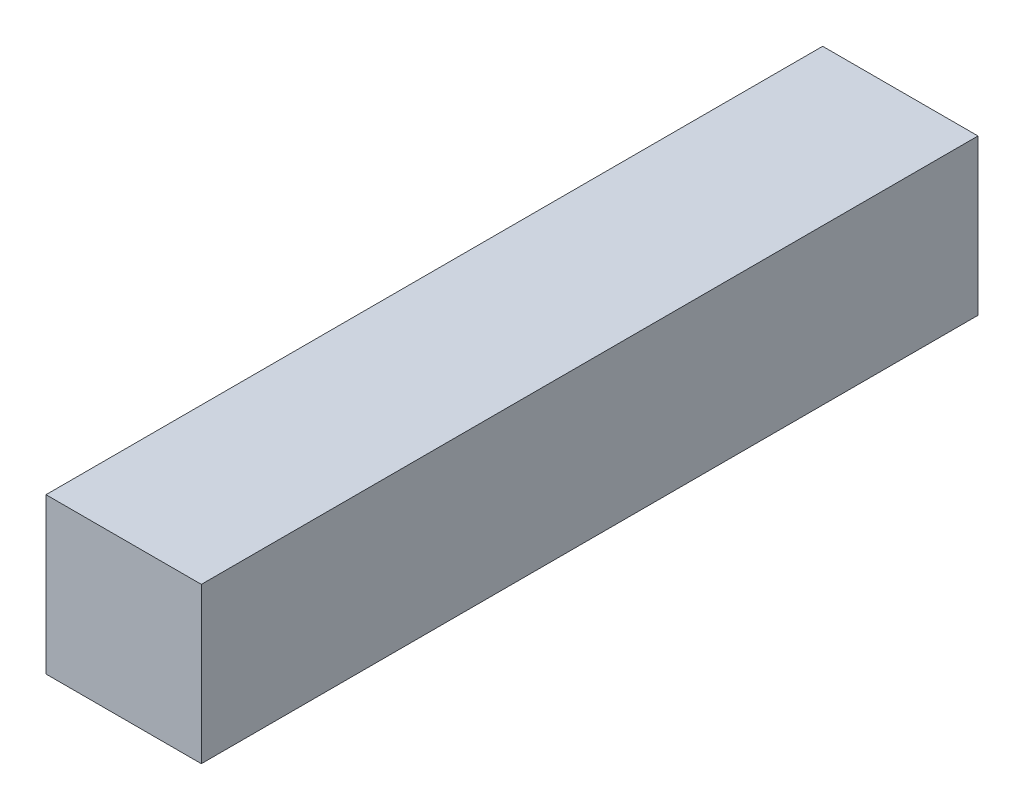
ISO-10303-21;
HEADER;
FILE_DESCRIPTION(('STEP AP214'),'2;1');
FILE_NAME('part.step','',(''),(''),'','','');
FILE_SCHEMA(('AUTOMOTIVE_DESIGN { 1 0 10303 214 1 1 1 1 }'));
ENDSEC;
DATA;
#1=APPLICATION_CONTEXT('core data for automotive mechanical design processes');
#2=APPLICATION_PROTOCOL_DEFINITION('international standard','automotive_design',2000,#1);
#3=PRODUCT_CONTEXT('',#1,'mechanical');
#4=PRODUCT('Part','Part','',(#3));
#5=PRODUCT_RELATED_PRODUCT_CATEGORY('part','',(#4));
#6=PRODUCT_DEFINITION_FORMATION('','',#4);
#7=PRODUCT_DEFINITION_CONTEXT('part definition',#1,'design');
#8=PRODUCT_DEFINITION('design','',#6,#7);
#9=PRODUCT_DEFINITION_SHAPE('','',#8);
#10=(LENGTH_UNIT() NAMED_UNIT(*) SI_UNIT(.MILLI.,.METRE.));
#11=(NAMED_UNIT(*) PLANE_ANGLE_UNIT() SI_UNIT($,.RADIAN.));
#12=(NAMED_UNIT(*) SI_UNIT($,.STERADIAN.) SOLID_ANGLE_UNIT());
#13=UNCERTAINTY_MEASURE_WITH_UNIT(LENGTH_MEASURE(1.E-05),#10,'distance_accuracy_value','');
#14=(GEOMETRIC_REPRESENTATION_CONTEXT(3) GLOBAL_UNCERTAINTY_ASSIGNED_CONTEXT((#13)) GLOBAL_UNIT_ASSIGNED_CONTEXT((#10,
#11,#12)) REPRESENTATION_CONTEXT('',''));
#15=CARTESIAN_POINT('',(0.,0.,0.));
#16=DIRECTION('',(0.,0.,1.));
#17=DIRECTION('',(1.,0.,0.));
#18=AXIS2_PLACEMENT_3D('',#15,#16,#17);
#19=CARTESIAN_POINT('',(2.,4.,10.));
#20=DIRECTION('',(-1.,0.,0.));
#21=DIRECTION('',(0.,0.,1.));
#22=AXIS2_PLACEMENT_3D('',#19,#20,#21);
#23=PLANE('',#22);
#24=DIRECTION('',(0.,0.,-1.));
#25=VECTOR('',#24,1.);
#26=CARTESIAN_POINT('',(2.,0.,10.));
#27=LINE('',#26,#25);
#28=CARTESIAN_POINT('',(2.,0.,10.));
#29=VERTEX_POINT('',#28);
#30=CARTESIAN_POINT('',(2.,0.,-10.));
#31=VERTEX_POINT('',#30);
#32=EDGE_CURVE('E100',#29,#31,#27,.T.);
#33=ORIENTED_EDGE('',*,*,#32,.T.);
#34=DIRECTION('',(0.,-1.,0.));
#35=VECTOR('',#34,1.);
#36=CARTESIAN_POINT('',(2.,4.,-10.));
#37=LINE('',#36,#35);
#38=CARTESIAN_POINT('',(2.,4.,-10.));
#39=VERTEX_POINT('',#38);
#40=EDGE_CURVE('E11',#39,#31,#37,.T.);
#41=ORIENTED_EDGE('',*,*,#40,.F.);
#42=DIRECTION('',(0.,0.,-1.));
#43=VECTOR('',#42,1.);
#44=CARTESIAN_POINT('',(2.,4.,10.));
#45=LINE('',#44,#43);
#46=CARTESIAN_POINT('',(2.,4.,10.));
#47=VERTEX_POINT('',#46);
#48=EDGE_CURVE('E88',#47,#39,#45,.T.);
#49=ORIENTED_EDGE('',*,*,#48,.F.);
#50=DIRECTION('',(0.,-1.,0.));
#51=VECTOR('',#50,1.);
#52=CARTESIAN_POINT('',(2.,4.,10.));
#53=LINE('',#52,#51);
#54=EDGE_CURVE('E96',#47,#29,#53,.T.);
#55=ORIENTED_EDGE('',*,*,#54,.T.);
#56=EDGE_LOOP('',(#33,#41,#49,#55));
#57=FACE_BOUND('',#56,.T.);
#58=ADVANCED_FACE('F37',(#57),#23,.F.);
#59=CARTESIAN_POINT('',(-2.,4.,-10.));
#60=DIRECTION('',(0.,0.,1.));
#61=DIRECTION('',(1.,0.,0.));
#62=AXIS2_PLACEMENT_3D('',#59,#60,#61);
#63=PLANE('',#62);
#64=DIRECTION('',(-1.,0.,0.));
#65=VECTOR('',#64,1.);
#66=CARTESIAN_POINT('',(-2.,0.,-10.));
#67=LINE('',#66,#65);
#68=CARTESIAN_POINT('',(-2.,0.,-10.));
#69=VERTEX_POINT('',#68);
#70=EDGE_CURVE('E92',#31,#69,#67,.T.);
#71=ORIENTED_EDGE('',*,*,#70,.T.);
#72=DIRECTION('',(0.,-1.,0.));
#73=VECTOR('',#72,1.);
#74=CARTESIAN_POINT('',(-2.,4.,-10.));
#75=LINE('',#74,#73);
#76=CARTESIAN_POINT('',(-2.,4.,-10.));
#77=VERTEX_POINT('',#76);
#78=EDGE_CURVE('E45',#77,#69,#75,.T.);
#79=ORIENTED_EDGE('',*,*,#78,.F.);
#80=DIRECTION('',(-1.,0.,0.));
#81=VECTOR('',#80,1.);
#82=CARTESIAN_POINT('',(-2.,4.,-10.));
#83=LINE('',#82,#81);
#84=EDGE_CURVE('E83',#39,#77,#83,.T.);
#85=ORIENTED_EDGE('',*,*,#84,.F.);
#86=ORIENTED_EDGE('',*,*,#40,.T.);
#87=EDGE_LOOP('',(#71,#79,#85,#86));
#88=FACE_BOUND('',#87,.T.);
#89=ADVANCED_FACE('F91',(#88),#63,.F.);
#90=CARTESIAN_POINT('',(-2.,4.,10.));
#91=DIRECTION('',(1.,0.,0.));
#92=DIRECTION('',(0.,0.,-1.));
#93=AXIS2_PLACEMENT_3D('',#90,#91,#92);
#94=PLANE('',#93);
#95=DIRECTION('',(0.,0.,1.));
#96=VECTOR('',#95,1.);
#97=CARTESIAN_POINT('',(-2.,0.,10.));
#98=LINE('',#97,#96);
#99=CARTESIAN_POINT('',(-2.,0.,10.));
#100=VERTEX_POINT('',#99);
#101=EDGE_CURVE('E70',#69,#100,#98,.T.);
#102=ORIENTED_EDGE('',*,*,#101,.T.);
#103=DIRECTION('',(0.,-1.,0.));
#104=VECTOR('',#103,1.);
#105=CARTESIAN_POINT('',(-2.,4.,10.));
#106=LINE('',#105,#104);
#107=CARTESIAN_POINT('',(-2.,4.,10.));
#108=VERTEX_POINT('',#107);
#109=EDGE_CURVE('E93',#108,#100,#106,.T.);
#110=ORIENTED_EDGE('',*,*,#109,.F.);
#111=DIRECTION('',(0.,0.,1.));
#112=VECTOR('',#111,1.);
#113=CARTESIAN_POINT('',(-2.,4.,10.));
#114=LINE('',#113,#112);
#115=EDGE_CURVE('E86',#77,#108,#114,.T.);
#116=ORIENTED_EDGE('',*,*,#115,.F.);
#117=ORIENTED_EDGE('',*,*,#78,.T.);
#118=EDGE_LOOP('',(#102,#110,#116,#117));
#119=FACE_BOUND('',#118,.T.);
#120=ADVANCED_FACE('F94',(#119),#94,.F.);
#121=CARTESIAN_POINT('',(-2.,4.,10.));
#122=DIRECTION('',(0.,0.,-1.));
#123=DIRECTION('',(-1.,0.,0.));
#124=AXIS2_PLACEMENT_3D('',#121,#122,#123);
#125=PLANE('',#124);
#126=DIRECTION('',(1.,0.,0.));
#127=VECTOR('',#126,1.);
#128=CARTESIAN_POINT('',(-2.,0.,10.));
#129=LINE('',#128,#127);
#130=EDGE_CURVE('E76',#100,#29,#129,.T.);
#131=ORIENTED_EDGE('',*,*,#130,.T.);
#132=ORIENTED_EDGE('',*,*,#54,.F.);
#133=DIRECTION('',(1.,0.,0.));
#134=VECTOR('',#133,1.);
#135=CARTESIAN_POINT('',(-2.,4.,10.));
#136=LINE('',#135,#134);
#137=EDGE_CURVE('E53',#108,#47,#136,.T.);
#138=ORIENTED_EDGE('',*,*,#137,.F.);
#139=ORIENTED_EDGE('',*,*,#109,.T.);
#140=EDGE_LOOP('',(#131,#132,#138,#139));
#141=FACE_BOUND('',#140,.T.);
#142=ADVANCED_FACE('F107',(#141),#125,.F.);
#143=CARTESIAN_POINT('',(0.,4.,0.));
#144=DIRECTION('',(0.,-1.,0.));
#145=DIRECTION('',(0.,0.,-1.));
#146=AXIS2_PLACEMENT_3D('',#143,#144,#145);
#147=PLANE('',#146);
#148=ORIENTED_EDGE('',*,*,#48,.T.);
#149=ORIENTED_EDGE('',*,*,#84,.T.);
#150=ORIENTED_EDGE('',*,*,#115,.T.);
#151=ORIENTED_EDGE('',*,*,#137,.T.);
#152=EDGE_LOOP('',(#148,#149,#150,#151));
#153=FACE_BOUND('',#152,.T.);
#154=ADVANCED_FACE('F84',(#153),#147,.F.);
#155=CARTESIAN_POINT('',(0.,0.,0.));
#156=DIRECTION('',(0.,-1.,0.));
#157=DIRECTION('',(0.,0.,-1.));
#158=AXIS2_PLACEMENT_3D('',#155,#156,#157);
#159=PLANE('',#158);
#160=ORIENTED_EDGE('',*,*,#32,.F.);
#161=ORIENTED_EDGE('',*,*,#130,.F.);
#162=ORIENTED_EDGE('',*,*,#101,.F.);
#163=ORIENTED_EDGE('',*,*,#70,.F.);
#164=EDGE_LOOP('',(#160,#161,#162,#163));
#165=FACE_BOUND('',#164,.T.);
#166=ADVANCED_FACE('F110',(#165),#159,.T.);
#167=CLOSED_SHELL('',(#58,#89,#120,#142,#154,#166));
#168=MANIFOLD_SOLID_BREP('B2',#167);
#169=ADVANCED_BREP_SHAPE_REPRESENTATION('',(#18,#168),#14);
#170=SHAPE_DEFINITION_REPRESENTATION(#9,#169);
ENDSEC;
END-ISO-10303-21;
